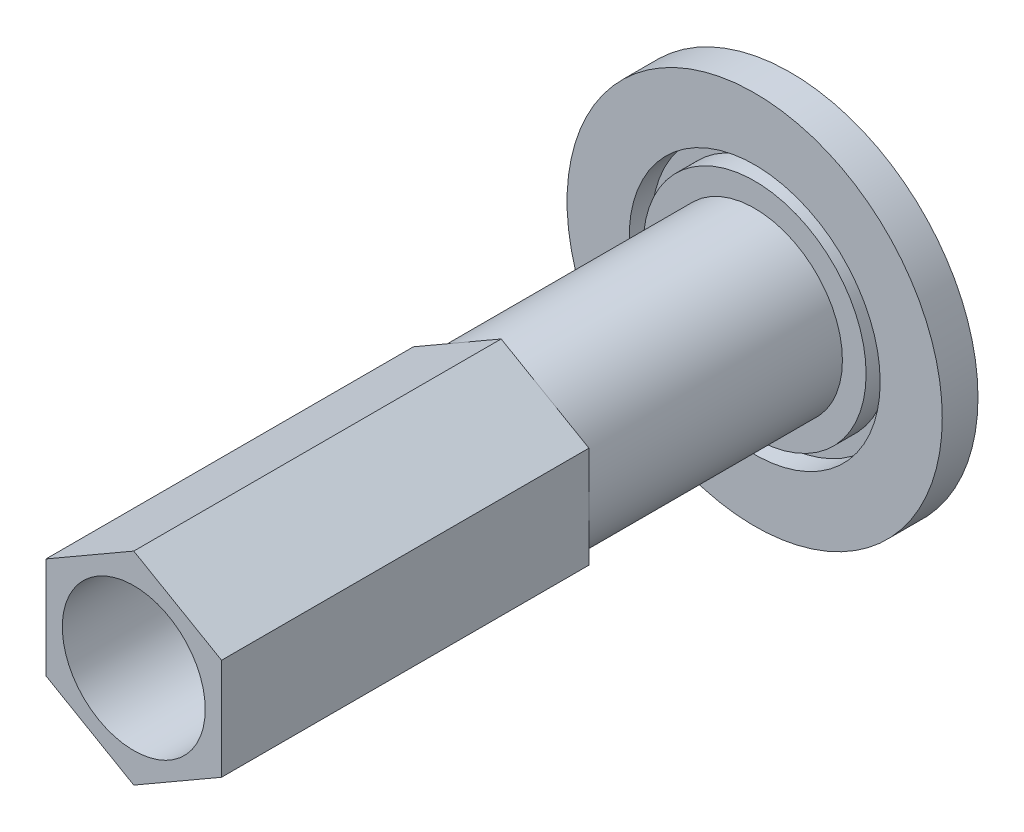
ISO-10303-21;
HEADER;
FILE_DESCRIPTION(('STEP AP214'),'2;1');
FILE_NAME('part.step','',(''),(''),'','','');
FILE_SCHEMA(('AUTOMOTIVE_DESIGN { 1 0 10303 214 1 1 1 1 }'));
ENDSEC;
DATA;
#1=APPLICATION_CONTEXT('core data for automotive mechanical design processes');
#2=APPLICATION_PROTOCOL_DEFINITION('international standard','automotive_design',2000,#1);
#3=PRODUCT_CONTEXT('',#1,'mechanical');
#4=PRODUCT('Part','Part','',(#3));
#5=PRODUCT_RELATED_PRODUCT_CATEGORY('part','',(#4));
#6=PRODUCT_DEFINITION_FORMATION('','',#4);
#7=PRODUCT_DEFINITION_CONTEXT('part definition',#1,'design');
#8=PRODUCT_DEFINITION('design','',#6,#7);
#9=PRODUCT_DEFINITION_SHAPE('','',#8);
#10=(LENGTH_UNIT() NAMED_UNIT(*) SI_UNIT(.MILLI.,.METRE.));
#11=(NAMED_UNIT(*) PLANE_ANGLE_UNIT() SI_UNIT($,.RADIAN.));
#12=(NAMED_UNIT(*) SI_UNIT($,.STERADIAN.) SOLID_ANGLE_UNIT());
#13=UNCERTAINTY_MEASURE_WITH_UNIT(LENGTH_MEASURE(1.E-05),#10,'distance_accuracy_value','');
#14=(GEOMETRIC_REPRESENTATION_CONTEXT(3) GLOBAL_UNCERTAINTY_ASSIGNED_CONTEXT((#13)) GLOBAL_UNIT_ASSIGNED_CONTEXT((#10,
#11,#12)) REPRESENTATION_CONTEXT('',''));
#15=CARTESIAN_POINT('',(0.,0.,0.));
#16=DIRECTION('',(0.,0.,1.));
#17=DIRECTION('',(1.,0.,0.));
#18=AXIS2_PLACEMENT_3D('',#15,#16,#17);
#19=CARTESIAN_POINT('',(0.,0.,39.8400230789255));
#20=DIRECTION('',(0.,0.,1.));
#21=DIRECTION('',(1.,0.,0.));
#22=AXIS2_PLACEMENT_3D('',#19,#20,#21);
#23=CYLINDRICAL_SURFACE('',#22,19.65);
#24=CARTESIAN_POINT('',(0.,0.,-68.));
#25=DIRECTION('',(0.,0.,1.));
#26=DIRECTION('',(1.,0.,0.));
#27=AXIS2_PLACEMENT_3D('',#24,#25,#26);
#28=CIRCLE('',#27,19.65);
#29=CARTESIAN_POINT('',(19.65,0.,-68.));
#30=VERTEX_POINT('',#29);
#31=EDGE_CURVE('E205',#30,#30,#28,.T.);
#32=ORIENTED_EDGE('',*,*,#31,.T.);
#33=EDGE_LOOP('',(#32));
#34=FACE_BOUND('',#33,.T.);
#35=CARTESIAN_POINT('',(0.,0.,-11.25));
#36=DIRECTION('',(0.,0.,1.));
#37=DIRECTION('',(1.,0.,0.));
#38=AXIS2_PLACEMENT_3D('',#35,#36,#37);
#39=CIRCLE('',#38,19.65);
#40=CARTESIAN_POINT('',(9.82499999999999,17.0173991843642,-11.25));
#41=VERTEX_POINT('',#40);
#42=CARTESIAN_POINT('',(19.65,0.,-11.25));
#43=VERTEX_POINT('',#42);
#44=EDGE_CURVE('E40',#41,#43,#39,.F.);
#45=ORIENTED_EDGE('',*,*,#44,.T.);
#46=CARTESIAN_POINT('',(9.825,-17.0173991843642,-11.25));
#47=VERTEX_POINT('',#46);
#48=EDGE_CURVE('E11',#43,#47,#39,.F.);
#49=ORIENTED_EDGE('',*,*,#48,.T.);
#50=CARTESIAN_POINT('',(-9.825,-17.0173991843642,-11.25));
#51=VERTEX_POINT('',#50);
#52=EDGE_CURVE('E45',#47,#51,#39,.F.);
#53=ORIENTED_EDGE('',*,*,#52,.T.);
#54=CARTESIAN_POINT('',(-19.65,0.,-11.25));
#55=VERTEX_POINT('',#54);
#56=EDGE_CURVE('E217',#51,#55,#39,.F.);
#57=ORIENTED_EDGE('',*,*,#56,.T.);
#58=CARTESIAN_POINT('',(-9.825,17.0173991843642,-11.25));
#59=VERTEX_POINT('',#58);
#60=EDGE_CURVE('E216',#55,#59,#39,.F.);
#61=ORIENTED_EDGE('',*,*,#60,.T.);
#62=EDGE_CURVE('E60',#59,#41,#39,.F.);
#63=ORIENTED_EDGE('',*,*,#62,.T.);
#64=EDGE_LOOP('',(#45,#49,#53,#57,#61,#63));
#65=FACE_BOUND('',#64,.T.);
#66=ADVANCED_FACE('F36',(#34,#65),#23,.T.);
#67=CARTESIAN_POINT('',(19.65,0.,-68.));
#68=DIRECTION('',(0.,0.,1.));
#69=DIRECTION('',(1.,0.,0.));
#70=AXIS2_PLACEMENT_3D('',#67,#68,#69);
#71=PLANE('',#70);
#72=CARTESIAN_POINT('',(0.,0.,-68.));
#73=DIRECTION('',(0.,0.,1.));
#74=DIRECTION('',(1.,0.,0.));
#75=AXIS2_PLACEMENT_3D('',#72,#73,#74);
#76=CIRCLE('',#75,24.95);
#77=CARTESIAN_POINT('',(24.95,0.,-68.));
#78=VERTEX_POINT('',#77);
#79=EDGE_CURVE('E202',#78,#78,#76,.T.);
#80=ORIENTED_EDGE('',*,*,#79,.T.);
#81=EDGE_LOOP('',(#80));
#82=FACE_BOUND('',#81,.T.);
#83=ORIENTED_EDGE('',*,*,#31,.F.);
#84=EDGE_LOOP('',(#83));
#85=FACE_BOUND('',#84,.T.);
#86=ADVANCED_FACE('F253',(#82,#85),#71,.T.);
#87=CARTESIAN_POINT('',(0.,0.,39.8400230789255));
#88=DIRECTION('',(0.,0.,1.));
#89=DIRECTION('',(1.,0.,0.));
#90=AXIS2_PLACEMENT_3D('',#87,#88,#89);
#91=CYLINDRICAL_SURFACE('',#90,24.95);
#92=CARTESIAN_POINT('',(0.,0.,-73.));
#93=DIRECTION('',(0.,0.,1.));
#94=DIRECTION('',(1.,0.,0.));
#95=AXIS2_PLACEMENT_3D('',#92,#93,#94);
#96=CIRCLE('',#95,24.95);
#97=CARTESIAN_POINT('',(24.95,0.,-73.));
#98=VERTEX_POINT('',#97);
#99=EDGE_CURVE('E199',#98,#98,#96,.T.);
#100=ORIENTED_EDGE('',*,*,#99,.T.);
#101=EDGE_LOOP('',(#100));
#102=FACE_BOUND('',#101,.T.);
#103=ORIENTED_EDGE('',*,*,#79,.F.);
#104=EDGE_LOOP('',(#103));
#105=FACE_BOUND('',#104,.T.);
#106=ADVANCED_FACE('F259',(#102,#105),#91,.T.);
#107=CARTESIAN_POINT('',(24.95,0.,-73.));
#108=DIRECTION('',(0.,0.,1.));
#109=DIRECTION('',(1.,0.,0.));
#110=AXIS2_PLACEMENT_3D('',#107,#108,#109);
#111=PLANE('',#110);
#112=CARTESIAN_POINT('',(0.,0.,-73.));
#113=DIRECTION('',(0.,0.,1.));
#114=DIRECTION('',(1.,0.,0.));
#115=AXIS2_PLACEMENT_3D('',#112,#113,#114);
#116=CIRCLE('',#115,28.1);
#117=CARTESIAN_POINT('',(28.1,0.,-73.));
#118=VERTEX_POINT('',#117);
#119=EDGE_CURVE('E196',#118,#118,#116,.T.);
#120=ORIENTED_EDGE('',*,*,#119,.T.);
#121=EDGE_LOOP('',(#120));
#122=FACE_BOUND('',#121,.T.);
#123=ORIENTED_EDGE('',*,*,#99,.F.);
#124=EDGE_LOOP('',(#123));
#125=FACE_BOUND('',#124,.T.);
#126=ADVANCED_FACE('F328',(#122,#125),#111,.T.);
#127=CARTESIAN_POINT('',(0.,0.,39.8400230789255));
#128=DIRECTION('',(0.,0.,1.));
#129=DIRECTION('',(1.,0.,0.));
#130=AXIS2_PLACEMENT_3D('',#127,#128,#129);
#131=CYLINDRICAL_SURFACE('',#130,28.1);
#132=CARTESIAN_POINT('',(0.,0.,-68.));
#133=DIRECTION('',(0.,0.,1.));
#134=DIRECTION('',(1.,0.,0.));
#135=AXIS2_PLACEMENT_3D('',#132,#133,#134);
#136=CIRCLE('',#135,28.1);
#137=CARTESIAN_POINT('',(28.1,0.,-68.));
#138=VERTEX_POINT('',#137);
#139=EDGE_CURVE('E193',#138,#138,#136,.T.);
#140=ORIENTED_EDGE('',*,*,#139,.T.);
#141=EDGE_LOOP('',(#140));
#142=FACE_BOUND('',#141,.T.);
#143=ORIENTED_EDGE('',*,*,#119,.F.);
#144=EDGE_LOOP('',(#143));
#145=FACE_BOUND('',#144,.T.);
#146=ADVANCED_FACE('F324',(#142,#145),#131,.F.);
#147=CARTESIAN_POINT('',(28.1,0.,-68.));
#148=DIRECTION('',(0.,0.,1.));
#149=DIRECTION('',(1.,0.,0.));
#150=AXIS2_PLACEMENT_3D('',#147,#148,#149);
#151=PLANE('',#150);
#152=CARTESIAN_POINT('',(0.,0.,-68.));
#153=DIRECTION('',(0.,0.,1.));
#154=DIRECTION('',(1.,0.,0.));
#155=AXIS2_PLACEMENT_3D('',#152,#153,#154);
#156=CIRCLE('',#155,42.);
#157=CARTESIAN_POINT('',(42.,0.,-68.));
#158=VERTEX_POINT('',#157);
#159=EDGE_CURVE('E190',#158,#158,#156,.T.);
#160=ORIENTED_EDGE('',*,*,#159,.T.);
#161=EDGE_LOOP('',(#160));
#162=FACE_BOUND('',#161,.T.);
#163=ORIENTED_EDGE('',*,*,#139,.F.);
#164=EDGE_LOOP('',(#163));
#165=FACE_BOUND('',#164,.T.);
#166=ADVANCED_FACE('F320',(#162,#165),#151,.T.);
#167=CARTESIAN_POINT('',(0.,0.,39.8400230789255));
#168=DIRECTION('',(0.,0.,1.));
#169=DIRECTION('',(1.,0.,0.));
#170=AXIS2_PLACEMENT_3D('',#167,#168,#169);
#171=CYLINDRICAL_SURFACE('',#170,42.);
#172=CARTESIAN_POINT('',(0.,0.,-76.));
#173=DIRECTION('',(0.,0.,1.));
#174=DIRECTION('',(1.,0.,0.));
#175=AXIS2_PLACEMENT_3D('',#172,#173,#174);
#176=CIRCLE('',#175,42.);
#177=CARTESIAN_POINT('',(42.,0.,-76.));
#178=VERTEX_POINT('',#177);
#179=EDGE_CURVE('E187',#178,#178,#176,.T.);
#180=ORIENTED_EDGE('',*,*,#179,.T.);
#181=EDGE_LOOP('',(#180));
#182=FACE_BOUND('',#181,.T.);
#183=ORIENTED_EDGE('',*,*,#159,.F.);
#184=EDGE_LOOP('',(#183));
#185=FACE_BOUND('',#184,.T.);
#186=ADVANCED_FACE('F316',(#182,#185),#171,.T.);
#187=CARTESIAN_POINT('',(42.,0.,-76.));
#188=DIRECTION('',(0.,0.,-1.));
#189=DIRECTION('',(-1.,0.,0.));
#190=AXIS2_PLACEMENT_3D('',#187,#188,#189);
#191=PLANE('',#190);
#192=CARTESIAN_POINT('',(0.,0.,-76.));
#193=DIRECTION('',(0.,0.,1.));
#194=DIRECTION('',(1.,0.,0.));
#195=AXIS2_PLACEMENT_3D('',#192,#193,#194);
#196=CIRCLE('',#195,16.65);
#197=CARTESIAN_POINT('',(16.65,0.,-76.));
#198=VERTEX_POINT('',#197);
#199=EDGE_CURVE('E184',#198,#198,#196,.T.);
#200=ORIENTED_EDGE('',*,*,#199,.T.);
#201=EDGE_LOOP('',(#200));
#202=FACE_BOUND('',#201,.T.);
#203=ORIENTED_EDGE('',*,*,#179,.F.);
#204=EDGE_LOOP('',(#203));
#205=FACE_BOUND('',#204,.T.);
#206=ADVANCED_FACE('F312',(#202,#205),#191,.T.);
#207=CARTESIAN_POINT('',(0.,0.,39.8400230789255));
#208=DIRECTION('',(0.,0.,1.));
#209=DIRECTION('',(1.,0.,0.));
#210=AXIS2_PLACEMENT_3D('',#207,#208,#209);
#211=CYLINDRICAL_SURFACE('',#210,16.65);
#212=CARTESIAN_POINT('',(0.,0.,-18.0043668751683));
#213=DIRECTION('',(0.,0.,1.));
#214=DIRECTION('',(1.,0.,0.));
#215=AXIS2_PLACEMENT_3D('',#212,#213,#214);
#216=CIRCLE('',#215,16.65);
#217=CARTESIAN_POINT('',(16.65,0.,-18.0043668751683));
#218=VERTEX_POINT('',#217);
#219=EDGE_CURVE('E181',#218,#218,#216,.T.);
#220=ORIENTED_EDGE('',*,*,#219,.T.);
#221=EDGE_LOOP('',(#220));
#222=FACE_BOUND('',#221,.T.);
#223=ORIENTED_EDGE('',*,*,#199,.F.);
#224=EDGE_LOOP('',(#223));
#225=FACE_BOUND('',#224,.T.);
#226=ADVANCED_FACE('F308',(#222,#225),#211,.F.);
#227=CARTESIAN_POINT('',(16.65,0.,-18.0043668751683));
#228=DIRECTION('',(0.,0.,-1.));
#229=DIRECTION('',(-1.,0.,0.));
#230=AXIS2_PLACEMENT_3D('',#227,#228,#229);
#231=PLANE('',#230);
#232=CARTESIAN_POINT('',(0.,0.,-18.0043668751683));
#233=DIRECTION('',(0.,0.,1.));
#234=DIRECTION('',(1.,0.,0.));
#235=AXIS2_PLACEMENT_3D('',#232,#233,#234);
#236=CIRCLE('',#235,12.);
#237=CARTESIAN_POINT('',(12.,0.,-18.0043668751683));
#238=VERTEX_POINT('',#237);
#239=EDGE_CURVE('E178',#238,#238,#236,.T.);
#240=ORIENTED_EDGE('',*,*,#239,.T.);
#241=EDGE_LOOP('',(#240));
#242=FACE_BOUND('',#241,.T.);
#243=ORIENTED_EDGE('',*,*,#219,.F.);
#244=EDGE_LOOP('',(#243));
#245=FACE_BOUND('',#244,.T.);
#246=ADVANCED_FACE('F304',(#242,#245),#231,.T.);
#247=CARTESIAN_POINT('',(0.,0.,39.8400230789255));
#248=DIRECTION('',(0.,0.,1.));
#249=DIRECTION('',(1.,0.,0.));
#250=AXIS2_PLACEMENT_3D('',#247,#248,#249);
#251=CYLINDRICAL_SURFACE('',#250,12.);
#252=CARTESIAN_POINT('',(0.,0.,-24.8826821669282));
#253=DIRECTION('',(0.,0.,1.));
#254=DIRECTION('',(1.,0.,0.));
#255=AXIS2_PLACEMENT_3D('',#252,#253,#254);
#256=CIRCLE('',#255,12.);
#257=CARTESIAN_POINT('',(12.,0.,-24.8826821669282));
#258=VERTEX_POINT('',#257);
#259=EDGE_CURVE('E165',#258,#258,#256,.T.);
#260=ORIENTED_EDGE('',*,*,#259,.T.);
#261=EDGE_LOOP('',(#260));
#262=FACE_BOUND('',#261,.T.);
#263=ORIENTED_EDGE('',*,*,#239,.F.);
#264=EDGE_LOOP('',(#263));
#265=FACE_BOUND('',#264,.T.);
#266=ADVANCED_FACE('F300',(#262,#265),#251,.T.);
#267=CARTESIAN_POINT('',(12.,0.,-24.8826821669282));
#268=DIRECTION('',(0.,0.,-1.));
#269=DIRECTION('',(-1.,0.,0.));
#270=AXIS2_PLACEMENT_3D('',#267,#268,#269);
#271=PLANE('',#270);
#272=ORIENTED_EDGE('',*,*,#259,.F.);
#273=EDGE_LOOP('',(#272));
#274=FACE_BOUND('',#273,.T.);
#275=ADVANCED_FACE('F297',(#274),#271,.T.);
#276=CARTESIAN_POINT('',(19.65,11.3449327895762,-11.25));
#277=DIRECTION('',(0.5,0.866025403784439,0.));
#278=DIRECTION('',(-0.866025403784439,0.5,0.));
#279=AXIS2_PLACEMENT_3D('',#276,#277,#278);
#280=PLANE('',#279);
#281=DIRECTION('',(-0.866025403784439,0.5,0.));
#282=VECTOR('',#281,1.);
#283=CARTESIAN_POINT('',(19.65,11.3449327895762,-11.25));
#284=LINE('',#283,#282);
#285=CARTESIAN_POINT('',(19.65,11.3449327895762,-11.25));
#286=VERTEX_POINT('',#285);
#287=EDGE_CURVE('E118',#286,#41,#284,.T.);
#288=ORIENTED_EDGE('',*,*,#287,.T.);
#289=CARTESIAN_POINT('',(0.,22.6898655791523,-11.25));
#290=VERTEX_POINT('',#289);
#291=EDGE_CURVE('E111',#41,#290,#284,.T.);
#292=ORIENTED_EDGE('',*,*,#291,.T.);
#293=DIRECTION('',(0.,0.,1.));
#294=VECTOR('',#293,1.);
#295=CARTESIAN_POINT('',(0.,22.6898655791523,-11.25));
#296=LINE('',#295,#294);
#297=CARTESIAN_POINT('',(0.,22.6898655791523,71.));
#298=VERTEX_POINT('',#297);
#299=EDGE_CURVE('E115',#290,#298,#296,.T.);
#300=ORIENTED_EDGE('',*,*,#299,.T.);
#301=DIRECTION('',(-0.866025403784439,0.5,0.));
#302=VECTOR('',#301,1.);
#303=CARTESIAN_POINT('',(19.65,11.3449327895762,71.));
#304=LINE('',#303,#302);
#305=CARTESIAN_POINT('',(19.65,11.3449327895762,71.));
#306=VERTEX_POINT('',#305);
#307=EDGE_CURVE('E150',#306,#298,#304,.T.);
#308=ORIENTED_EDGE('',*,*,#307,.F.);
#309=DIRECTION('',(0.,0.,1.));
#310=VECTOR('',#309,1.);
#311=CARTESIAN_POINT('',(19.65,11.3449327895762,-11.25));
#312=LINE('',#311,#310);
#313=EDGE_CURVE('E162',#286,#306,#312,.T.);
#314=ORIENTED_EDGE('',*,*,#313,.F.);
#315=EDGE_LOOP('',(#288,#292,#300,#308,#314));
#316=FACE_BOUND('',#315,.T.);
#317=ADVANCED_FACE('F113',(#316),#280,.T.);
#318=CARTESIAN_POINT('',(19.65,-11.3449327895761,-11.25));
#319=DIRECTION('',(1.,0.,0.));
#320=DIRECTION('',(0.,1.,0.));
#321=AXIS2_PLACEMENT_3D('',#318,#319,#320);
#322=PLANE('',#321);
#323=DIRECTION('',(0.,1.,0.));
#324=VECTOR('',#323,1.);
#325=CARTESIAN_POINT('',(19.65,-11.3449327895761,-11.25));
#326=LINE('',#325,#324);
#327=CARTESIAN_POINT('',(19.65,-11.3449327895761,-11.25));
#328=VERTEX_POINT('',#327);
#329=EDGE_CURVE('E52',#328,#43,#326,.T.);
#330=ORIENTED_EDGE('',*,*,#329,.T.);
#331=EDGE_CURVE('E148',#43,#286,#326,.T.);
#332=ORIENTED_EDGE('',*,*,#331,.T.);
#333=ORIENTED_EDGE('',*,*,#313,.T.);
#334=DIRECTION('',(0.,1.,0.));
#335=VECTOR('',#334,1.);
#336=CARTESIAN_POINT('',(19.65,-11.3449327895761,71.));
#337=LINE('',#336,#335);
#338=CARTESIAN_POINT('',(19.65,-11.3449327895761,71.));
#339=VERTEX_POINT('',#338);
#340=EDGE_CURVE('E119',#339,#306,#337,.T.);
#341=ORIENTED_EDGE('',*,*,#340,.F.);
#342=DIRECTION('',(0.,0.,1.));
#343=VECTOR('',#342,1.);
#344=CARTESIAN_POINT('',(19.65,-11.3449327895761,-11.25));
#345=LINE('',#344,#343);
#346=EDGE_CURVE('E166',#328,#339,#345,.T.);
#347=ORIENTED_EDGE('',*,*,#346,.F.);
#348=EDGE_LOOP('',(#330,#332,#333,#341,#347));
#349=FACE_BOUND('',#348,.T.);
#350=ADVANCED_FACE('F296',(#349),#322,.T.);
#351=CARTESIAN_POINT('',(0.,-22.6898655791523,-11.25));
#352=DIRECTION('',(0.5,-0.866025403784439,0.));
#353=DIRECTION('',(0.866025403784439,0.5,0.));
#354=AXIS2_PLACEMENT_3D('',#351,#352,#353);
#355=PLANE('',#354);
#356=DIRECTION('',(0.866025403784439,0.5,0.));
#357=VECTOR('',#356,1.);
#358=CARTESIAN_POINT('',(0.,-22.6898655791523,-11.25));
#359=LINE('',#358,#357);
#360=CARTESIAN_POINT('',(0.,-22.6898655791523,-11.25));
#361=VERTEX_POINT('',#360);
#362=EDGE_CURVE('E145',#361,#47,#359,.T.);
#363=ORIENTED_EDGE('',*,*,#362,.T.);
#364=EDGE_CURVE('E144',#47,#328,#359,.T.);
#365=ORIENTED_EDGE('',*,*,#364,.T.);
#366=ORIENTED_EDGE('',*,*,#346,.T.);
#367=DIRECTION('',(0.866025403784439,0.5,0.));
#368=VECTOR('',#367,1.);
#369=CARTESIAN_POINT('',(0.,-22.6898655791523,71.));
#370=LINE('',#369,#368);
#371=CARTESIAN_POINT('',(0.,-22.6898655791523,71.));
#372=VERTEX_POINT('',#371);
#373=EDGE_CURVE('E159',#372,#339,#370,.T.);
#374=ORIENTED_EDGE('',*,*,#373,.F.);
#375=DIRECTION('',(0.,0.,1.));
#376=VECTOR('',#375,1.);
#377=CARTESIAN_POINT('',(0.,-22.6898655791523,-11.25));
#378=LINE('',#377,#376);
#379=EDGE_CURVE('E169',#361,#372,#378,.T.);
#380=ORIENTED_EDGE('',*,*,#379,.F.);
#381=EDGE_LOOP('',(#363,#365,#366,#374,#380));
#382=FACE_BOUND('',#381,.T.);
#383=ADVANCED_FACE('F230',(#382),#355,.T.);
#384=CARTESIAN_POINT('',(-19.65,-11.3449327895761,-11.25));
#385=DIRECTION('',(-0.5,-0.866025403784439,0.));
#386=DIRECTION('',(0.866025403784439,-0.5,0.));
#387=AXIS2_PLACEMENT_3D('',#384,#385,#386);
#388=PLANE('',#387);
#389=DIRECTION('',(0.866025403784439,-0.5,0.));
#390=VECTOR('',#389,1.);
#391=CARTESIAN_POINT('',(-19.65,-11.3449327895761,-11.25));
#392=LINE('',#391,#390);
#393=CARTESIAN_POINT('',(-19.65,-11.3449327895761,-11.25));
#394=VERTEX_POINT('',#393);
#395=EDGE_CURVE('E141',#394,#51,#392,.T.);
#396=ORIENTED_EDGE('',*,*,#395,.T.);
#397=EDGE_CURVE('E140',#51,#361,#392,.T.);
#398=ORIENTED_EDGE('',*,*,#397,.T.);
#399=ORIENTED_EDGE('',*,*,#379,.T.);
#400=DIRECTION('',(0.866025403784439,-0.5,0.));
#401=VECTOR('',#400,1.);
#402=CARTESIAN_POINT('',(-19.65,-11.3449327895761,71.));
#403=LINE('',#402,#401);
#404=CARTESIAN_POINT('',(-19.65,-11.3449327895761,71.));
#405=VERTEX_POINT('',#404);
#406=EDGE_CURVE('E156',#405,#372,#403,.T.);
#407=ORIENTED_EDGE('',*,*,#406,.F.);
#408=DIRECTION('',(0.,0.,1.));
#409=VECTOR('',#408,1.);
#410=CARTESIAN_POINT('',(-19.65,-11.3449327895761,-11.25));
#411=LINE('',#410,#409);
#412=EDGE_CURVE('E172',#394,#405,#411,.T.);
#413=ORIENTED_EDGE('',*,*,#412,.F.);
#414=EDGE_LOOP('',(#396,#398,#399,#407,#413));
#415=FACE_BOUND('',#414,.T.);
#416=ADVANCED_FACE('F232',(#415),#388,.T.);
#417=CARTESIAN_POINT('',(-19.65,11.3449327895761,-11.25));
#418=DIRECTION('',(-1.,0.,0.));
#419=DIRECTION('',(0.,-1.,0.));
#420=AXIS2_PLACEMENT_3D('',#417,#418,#419);
#421=PLANE('',#420);
#422=DIRECTION('',(0.,-1.,0.));
#423=VECTOR('',#422,1.);
#424=CARTESIAN_POINT('',(-19.65,11.3449327895761,-11.25));
#425=LINE('',#424,#423);
#426=CARTESIAN_POINT('',(-19.65,11.3449327895761,-11.25));
#427=VERTEX_POINT('',#426);
#428=EDGE_CURVE('E136',#427,#55,#425,.T.);
#429=ORIENTED_EDGE('',*,*,#428,.T.);
#430=EDGE_CURVE('E133',#55,#394,#425,.T.);
#431=ORIENTED_EDGE('',*,*,#430,.T.);
#432=ORIENTED_EDGE('',*,*,#412,.T.);
#433=DIRECTION('',(0.,-1.,0.));
#434=VECTOR('',#433,1.);
#435=CARTESIAN_POINT('',(-19.65,11.3449327895761,71.));
#436=LINE('',#435,#434);
#437=CARTESIAN_POINT('',(-19.65,11.3449327895761,71.));
#438=VERTEX_POINT('',#437);
#439=EDGE_CURVE('E153',#438,#405,#436,.T.);
#440=ORIENTED_EDGE('',*,*,#439,.F.);
#441=DIRECTION('',(0.,0.,1.));
#442=VECTOR('',#441,1.);
#443=CARTESIAN_POINT('',(-19.65,11.3449327895761,-11.25));
#444=LINE('',#443,#442);
#445=EDGE_CURVE('E130',#427,#438,#444,.T.);
#446=ORIENTED_EDGE('',*,*,#445,.F.);
#447=EDGE_LOOP('',(#429,#431,#432,#440,#446));
#448=FACE_BOUND('',#447,.T.);
#449=ADVANCED_FACE('F241',(#448),#421,.T.);
#450=CARTESIAN_POINT('',(0.,22.6898655791523,-11.25));
#451=DIRECTION('',(-0.5,0.866025403784438,0.));
#452=DIRECTION('',(-0.866025403784439,-0.5,0.));
#453=AXIS2_PLACEMENT_3D('',#450,#451,#452);
#454=PLANE('',#453);
#455=DIRECTION('',(-0.866025403784439,-0.5,0.));
#456=VECTOR('',#455,1.);
#457=CARTESIAN_POINT('',(0.,22.6898655791523,-11.25));
#458=LINE('',#457,#456);
#459=EDGE_CURVE('E124',#290,#59,#458,.T.);
#460=ORIENTED_EDGE('',*,*,#459,.T.);
#461=EDGE_CURVE('E134',#59,#427,#458,.T.);
#462=ORIENTED_EDGE('',*,*,#461,.T.);
#463=ORIENTED_EDGE('',*,*,#445,.T.);
#464=DIRECTION('',(-0.866025403784439,-0.5,0.));
#465=VECTOR('',#464,1.);
#466=CARTESIAN_POINT('',(0.,22.6898655791523,71.));
#467=LINE('',#466,#465);
#468=EDGE_CURVE('E128',#298,#438,#467,.T.);
#469=ORIENTED_EDGE('',*,*,#468,.F.);
#470=ORIENTED_EDGE('',*,*,#299,.F.);
#471=EDGE_LOOP('',(#460,#462,#463,#469,#470));
#472=FACE_BOUND('',#471,.T.);
#473=ADVANCED_FACE('F123',(#472),#454,.T.);
#474=CARTESIAN_POINT('',(0.,0.,-11.25));
#475=DIRECTION('',(0.,0.,1.));
#476=DIRECTION('',(1.,0.,0.));
#477=AXIS2_PLACEMENT_3D('',#474,#475,#476);
#478=PLANE('',#477);
#479=ORIENTED_EDGE('',*,*,#48,.F.);
#480=ORIENTED_EDGE('',*,*,#329,.F.);
#481=ORIENTED_EDGE('',*,*,#364,.F.);
#482=EDGE_LOOP('',(#479,#480,#481));
#483=FACE_BOUND('',#482,.T.);
#484=ADVANCED_FACE('F227',(#483),#478,.F.);
#485=ORIENTED_EDGE('',*,*,#52,.F.);
#486=ORIENTED_EDGE('',*,*,#362,.F.);
#487=ORIENTED_EDGE('',*,*,#397,.F.);
#488=EDGE_LOOP('',(#485,#486,#487));
#489=FACE_BOUND('',#488,.T.);
#490=ADVANCED_FACE('F225',(#489),#478,.F.);
#491=ORIENTED_EDGE('',*,*,#56,.F.);
#492=ORIENTED_EDGE('',*,*,#395,.F.);
#493=ORIENTED_EDGE('',*,*,#430,.F.);
#494=EDGE_LOOP('',(#491,#492,#493));
#495=FACE_BOUND('',#494,.T.);
#496=ADVANCED_FACE('F237',(#495),#478,.F.);
#497=ORIENTED_EDGE('',*,*,#60,.F.);
#498=ORIENTED_EDGE('',*,*,#428,.F.);
#499=ORIENTED_EDGE('',*,*,#461,.F.);
#500=EDGE_LOOP('',(#497,#498,#499));
#501=FACE_BOUND('',#500,.T.);
#502=ADVANCED_FACE('F243',(#501),#478,.F.);
#503=ORIENTED_EDGE('',*,*,#62,.F.);
#504=ORIENTED_EDGE('',*,*,#459,.F.);
#505=ORIENTED_EDGE('',*,*,#291,.F.);
#506=EDGE_LOOP('',(#503,#504,#505));
#507=FACE_BOUND('',#506,.T.);
#508=ADVANCED_FACE('F132',(#507),#478,.F.);
#509=ORIENTED_EDGE('',*,*,#44,.F.);
#510=ORIENTED_EDGE('',*,*,#287,.F.);
#511=ORIENTED_EDGE('',*,*,#331,.F.);
#512=EDGE_LOOP('',(#509,#510,#511));
#513=FACE_BOUND('',#512,.T.);
#514=ADVANCED_FACE('F250',(#513),#478,.F.);
#515=CARTESIAN_POINT('',(0.,0.,0.));
#516=DIRECTION('',(0.,0.,1.));
#517=DIRECTION('',(1.,0.,0.));
#518=AXIS2_PLACEMENT_3D('',#515,#516,#517);
#519=PLANE('',#518);
#520=CARTESIAN_POINT('',(0.,0.,0.));
#521=DIRECTION('',(0.,0.,1.));
#522=DIRECTION('',(1.,0.,0.));
#523=AXIS2_PLACEMENT_3D('',#520,#521,#522);
#524=CIRCLE('',#523,16.);
#525=CARTESIAN_POINT('',(16.,0.,0.));
#526=VERTEX_POINT('',#525);
#527=EDGE_CURVE('E210',#526,#526,#524,.T.);
#528=ORIENTED_EDGE('',*,*,#527,.T.);
#529=EDGE_LOOP('',(#528));
#530=FACE_BOUND('',#529,.T.);
#531=ADVANCED_FACE('F38',(#530),#519,.T.);
#532=CARTESIAN_POINT('',(0.,0.,39.8400230789255));
#533=DIRECTION('',(0.,0.,1.));
#534=DIRECTION('',(1.,0.,0.));
#535=AXIS2_PLACEMENT_3D('',#532,#533,#534);
#536=CYLINDRICAL_SURFACE('',#535,16.);
#537=CARTESIAN_POINT('',(0.,0.,71.));
#538=DIRECTION('',(0.,0.,1.));
#539=DIRECTION('',(1.,0.,0.));
#540=AXIS2_PLACEMENT_3D('',#537,#538,#539);
#541=CIRCLE('',#540,16.);
#542=CARTESIAN_POINT('',(16.,0.,71.));
#543=VERTEX_POINT('',#542);
#544=EDGE_CURVE('E208',#543,#543,#541,.T.);
#545=ORIENTED_EDGE('',*,*,#544,.T.);
#546=EDGE_LOOP('',(#545));
#547=FACE_BOUND('',#546,.T.);
#548=ORIENTED_EDGE('',*,*,#527,.F.);
#549=EDGE_LOOP('',(#548));
#550=FACE_BOUND('',#549,.T.);
#551=ADVANCED_FACE('F266',(#547,#550),#536,.F.);
#552=CARTESIAN_POINT('',(16.,0.,71.));
#553=DIRECTION('',(0.,0.,1.));
#554=DIRECTION('',(1.,0.,0.));
#555=AXIS2_PLACEMENT_3D('',#552,#553,#554);
#556=PLANE('',#555);
#557=ORIENTED_EDGE('',*,*,#406,.T.);
#558=ORIENTED_EDGE('',*,*,#373,.T.);
#559=ORIENTED_EDGE('',*,*,#340,.T.);
#560=ORIENTED_EDGE('',*,*,#307,.T.);
#561=ORIENTED_EDGE('',*,*,#468,.T.);
#562=ORIENTED_EDGE('',*,*,#439,.T.);
#563=EDGE_LOOP('',(#557,#558,#559,#560,#561,#562));
#564=FACE_BOUND('',#563,.T.);
#565=ORIENTED_EDGE('',*,*,#544,.F.);
#566=EDGE_LOOP('',(#565));
#567=FACE_BOUND('',#566,.T.);
#568=ADVANCED_FACE('F264',(#564,#567),#556,.T.);
#569=CLOSED_SHELL('',(#66,#86,#106,#126,#146,#166,#186,#206,#226,#246,#266,#275,#317,#350,#383,
#416,#449,#473,#484,#490,#496,#502,#508,#514,#531,#551,#568));
#570=MANIFOLD_SOLID_BREP('B2',#569);
#571=ADVANCED_BREP_SHAPE_REPRESENTATION('',(#18,#570),#14);
#572=SHAPE_DEFINITION_REPRESENTATION(#9,#571);
ENDSEC;
END-ISO-10303-21;
